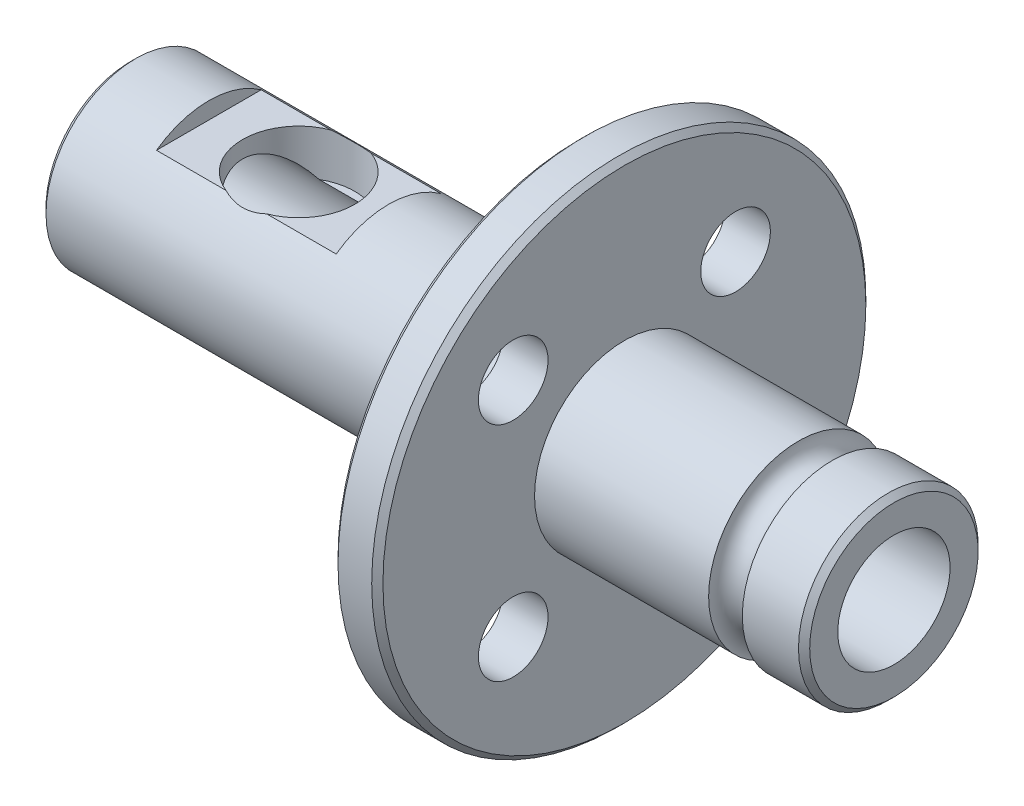
ISO-10303-21;
HEADER;
FILE_DESCRIPTION(('STEP AP214'),'2;1');
FILE_NAME('part.step','',(''),(''),'','','');
FILE_SCHEMA(('AUTOMOTIVE_DESIGN { 1 0 10303 214 1 1 1 1 }'));
ENDSEC;
DATA;
#1=APPLICATION_CONTEXT('core data for automotive mechanical design processes');
#2=APPLICATION_PROTOCOL_DEFINITION('international standard','automotive_design',2000,#1);
#3=PRODUCT_CONTEXT('',#1,'mechanical');
#4=PRODUCT('Part','Part','',(#3));
#5=PRODUCT_RELATED_PRODUCT_CATEGORY('part','',(#4));
#6=PRODUCT_DEFINITION_FORMATION('','',#4);
#7=PRODUCT_DEFINITION_CONTEXT('part definition',#1,'design');
#8=PRODUCT_DEFINITION('design','',#6,#7);
#9=PRODUCT_DEFINITION_SHAPE('','',#8);
#10=(LENGTH_UNIT() NAMED_UNIT(*) SI_UNIT(.MILLI.,.METRE.));
#11=(NAMED_UNIT(*) PLANE_ANGLE_UNIT() SI_UNIT($,.RADIAN.));
#12=(NAMED_UNIT(*) SI_UNIT($,.STERADIAN.) SOLID_ANGLE_UNIT());
#13=UNCERTAINTY_MEASURE_WITH_UNIT(LENGTH_MEASURE(1.E-05),#10,'distance_accuracy_value','');
#14=(GEOMETRIC_REPRESENTATION_CONTEXT(3) GLOBAL_UNCERTAINTY_ASSIGNED_CONTEXT((#13)) GLOBAL_UNIT_ASSIGNED_CONTEXT((#10,
#11,#12)) REPRESENTATION_CONTEXT('',''));
#15=CARTESIAN_POINT('',(0.,0.,0.));
#16=DIRECTION('',(0.,0.,1.));
#17=DIRECTION('',(1.,0.,0.));
#18=AXIS2_PLACEMENT_3D('',#15,#16,#17);
#19=CARTESIAN_POINT('',(0.,0.,0.));
#20=DIRECTION('',(1.,0.,0.));
#21=DIRECTION('',(0.,0.,-1.));
#22=AXIS2_PLACEMENT_3D('',#19,#20,#21);
#23=CYLINDRICAL_SURFACE('',#22,2.5);
#24=CARTESIAN_POINT('',(34.,0.,0.));
#25=DIRECTION('',(1.,0.,0.));
#26=DIRECTION('',(0.,0.,-1.));
#27=AXIS2_PLACEMENT_3D('',#24,#25,#26);
#28=CIRCLE('',#27,2.5);
#29=CARTESIAN_POINT('',(34.,0.,-2.5));
#30=VERTEX_POINT('',#29);
#31=EDGE_CURVE('E230',#30,#30,#28,.T.);
#32=ORIENTED_EDGE('',*,*,#31,.T.);
#33=EDGE_LOOP('',(#32));
#34=FACE_BOUND('',#33,.T.);
#35=CARTESIAN_POINT('',(0.,0.,0.));
#36=DIRECTION('',(1.,0.,0.));
#37=DIRECTION('',(0.,0.,-1.));
#38=AXIS2_PLACEMENT_3D('',#35,#36,#37);
#39=CIRCLE('',#38,2.5);
#40=CARTESIAN_POINT('',(0.,0.,-2.5));
#41=VERTEX_POINT('',#40);
#42=EDGE_CURVE('E231',#41,#41,#39,.T.);
#43=ORIENTED_EDGE('',*,*,#42,.F.);
#44=EDGE_LOOP('',(#43));
#45=FACE_BOUND('',#44,.T.);
#46=DIRECTION('',(1.,0.,0.));
#47=VECTOR('',#46,1.);
#48=CARTESIAN_POINT('',(0.,1.25,2.1650635094611));
#49=LINE('',#48,#47);
#50=CARTESIAN_POINT('',(8.75,1.25,2.1650635094611));
#51=VERTEX_POINT('',#50);
#52=CARTESIAN_POINT('',(6.25,1.25,2.1650635094611));
#53=VERTEX_POINT('',#52);
#54=EDGE_CURVE('E101',#51,#53,#49,.F.);
#55=ORIENTED_EDGE('',*,*,#54,.F.);
#56=CARTESIAN_POINT('',(7.5,0.,0.));
#57=DIRECTION('',(0.707106781186547,-0.707106781186547,0.));
#58=DIRECTION('',(0.707106781186547,0.707106781186547,0.));
#59=AXIS2_PLACEMENT_3D('',#56,#57,#58);
#60=ELLIPSE('',#59,3.53553390593274,2.5);
#61=CARTESIAN_POINT('',(8.75,1.25,-2.1650635094611));
#62=VERTEX_POINT('',#61);
#63=EDGE_CURVE('E89',#51,#62,#60,.F.);
#64=ORIENTED_EDGE('',*,*,#63,.T.);
#65=DIRECTION('',(1.,0.,0.));
#66=VECTOR('',#65,1.);
#67=CARTESIAN_POINT('',(0.,1.25,-2.1650635094611));
#68=LINE('',#67,#66);
#69=CARTESIAN_POINT('',(6.25,1.25,-2.1650635094611));
#70=VERTEX_POINT('',#69);
#71=EDGE_CURVE('E105',#70,#62,#68,.T.);
#72=ORIENTED_EDGE('',*,*,#71,.F.);
#73=CARTESIAN_POINT('',(7.5,0.,0.));
#74=DIRECTION('',(0.707106781186547,0.707106781186547,0.));
#75=DIRECTION('',(0.707106781186547,-0.707106781186547,0.));
#76=AXIS2_PLACEMENT_3D('',#73,#74,#75);
#77=ELLIPSE('',#76,3.53553390593274,2.5);
#78=EDGE_CURVE('E97',#70,#53,#77,.T.);
#79=ORIENTED_EDGE('',*,*,#78,.T.);
#80=EDGE_LOOP('',(#55,#64,#72,#79));
#81=FACE_BOUND('',#80,.T.);
#82=ADVANCED_FACE('F35',(#34,#45,#81),#23,.F.);
#83=CARTESIAN_POINT('',(0.,3.25,0.));
#84=DIRECTION('',(0.,1.,0.));
#85=DIRECTION('',(0.,0.,1.));
#86=AXIS2_PLACEMENT_3D('',#83,#84,#85);
#87=PLANE('',#86);
#88=CARTESIAN_POINT('',(7.5,3.25,0.));
#89=DIRECTION('',(0.,1.,0.));
#90=DIRECTION('',(0.,0.,1.));
#91=AXIS2_PLACEMENT_3D('',#88,#89,#90);
#92=CIRCLE('',#91,2.5);
#93=CARTESIAN_POINT('',(8.40138781886599,3.25,2.33184476327221));
#94=VERTEX_POINT('',#93);
#95=CARTESIAN_POINT('',(8.40138781886599,3.25,-2.33184476327221));
#96=VERTEX_POINT('',#95);
#97=EDGE_CURVE('E102',#94,#96,#92,.T.);
#98=ORIENTED_EDGE('',*,*,#97,.F.);
#99=DIRECTION('',(-1.,0.,0.));
#100=VECTOR('',#99,1.);
#101=CARTESIAN_POINT('',(0.,3.25,2.33184476327221));
#102=LINE('',#101,#100);
#103=CARTESIAN_POINT('',(11.5,3.25,2.33184476327221));
#104=VERTEX_POINT('',#103);
#105=EDGE_CURVE('E200',#94,#104,#102,.F.);
#106=ORIENTED_EDGE('',*,*,#105,.T.);
#107=DIRECTION('',(0.,0.,-1.));
#108=VECTOR('',#107,1.);
#109=CARTESIAN_POINT('',(11.5,3.25,-2.5));
#110=LINE('',#109,#108);
#111=CARTESIAN_POINT('',(11.5,3.25,-2.33184476327221));
#112=VERTEX_POINT('',#111);
#113=EDGE_CURVE('E220',#104,#112,#110,.T.);
#114=ORIENTED_EDGE('',*,*,#113,.T.);
#115=DIRECTION('',(-1.,0.,0.));
#116=VECTOR('',#115,1.);
#117=CARTESIAN_POINT('',(0.,3.25,-2.33184476327221));
#118=LINE('',#117,#116);
#119=EDGE_CURVE('E205',#112,#96,#118,.T.);
#120=ORIENTED_EDGE('',*,*,#119,.T.);
#121=EDGE_LOOP('',(#98,#106,#114,#120));
#122=FACE_BOUND('',#121,.T.);
#123=ADVANCED_FACE('F261',(#122),#87,.T.);
#124=CARTESIAN_POINT('',(0.,4.,0.));
#125=DIRECTION('',(1.,0.,0.));
#126=DIRECTION('',(0.,0.,-1.));
#127=AXIS2_PLACEMENT_3D('',#124,#125,#126);
#128=PLANE('',#127);
#129=CARTESIAN_POINT('',(0.,0.,0.));
#130=DIRECTION('',(1.,0.,0.));
#131=DIRECTION('',(0.,0.,-1.));
#132=AXIS2_PLACEMENT_3D('',#129,#130,#131);
#133=CIRCLE('',#132,3.75000000000001);
#134=CARTESIAN_POINT('',(0.,0.,-3.75000000000001));
#135=VERTEX_POINT('',#134);
#136=EDGE_CURVE('E116',#135,#135,#133,.F.);
#137=ORIENTED_EDGE('',*,*,#136,.T.);
#138=EDGE_LOOP('',(#137));
#139=FACE_BOUND('',#138,.T.);
#140=ORIENTED_EDGE('',*,*,#42,.T.);
#141=EDGE_LOOP('',(#140));
#142=FACE_BOUND('',#141,.T.);
#143=ADVANCED_FACE('F267',(#139,#142),#128,.F.);
#144=CARTESIAN_POINT('',(0.,0.,0.));
#145=DIRECTION('',(-1.,0.,0.));
#146=DIRECTION('',(0.,0.,1.));
#147=AXIS2_PLACEMENT_3D('',#144,#145,#146);
#148=CYLINDRICAL_SURFACE('',#147,4.);
#149=CARTESIAN_POINT('',(0.249999999999999,0.,0.));
#150=DIRECTION('',(1.,0.,0.));
#151=DIRECTION('',(0.,0.,-1.));
#152=AXIS2_PLACEMENT_3D('',#149,#150,#151);
#153=CIRCLE('',#152,4.);
#154=CARTESIAN_POINT('',(0.249999999999999,0.,-4.));
#155=VERTEX_POINT('',#154);
#156=EDGE_CURVE('E119',#155,#155,#153,.T.);
#157=ORIENTED_EDGE('',*,*,#156,.T.);
#158=EDGE_LOOP('',(#157));
#159=FACE_BOUND('',#158,.T.);
#160=CARTESIAN_POINT('',(6.59861218113401,3.25,-2.33184476327221));
#161=VERTEX_POINT('',#160);
#162=CARTESIAN_POINT('',(3.5,3.25,-2.33184476327221));
#163=VERTEX_POINT('',#162);
#164=EDGE_CURVE('E204',#161,#163,#118,.T.);
#165=ORIENTED_EDGE('',*,*,#164,.F.);
#166=CARTESIAN_POINT('',(6.59861218113401,3.25,-2.33184476327221));
#167=CARTESIAN_POINT('',(6.65107229883035,3.23545094828911,-2.35212058302273));
#168=CARTESIAN_POINT('',(6.70442824310383,3.22182658645101,-2.37071160075322));
#169=CARTESIAN_POINT('',(6.81279401949059,3.19678929465882,-2.40436642988356));
#170=CARTESIAN_POINT('',(6.86780517068709,3.18537818548835,-2.41942733926326));
#171=CARTESIAN_POINT('',(7.0346554506817,3.15510210712078,-2.45895458338862));
#172=CARTESIAN_POINT('',(7.14862216037379,3.14010445222921,-2.47788667647815));
#173=CARTESIAN_POINT('',(7.37964643909849,3.12268488518487,-2.49981057204269));
#174=CARTESIAN_POINT('',(7.49671724063432,3.12033039992166,-2.50271691027379));
#175=CARTESIAN_POINT('',(7.72960787339434,3.12876737924364,-2.4921581585379));
#176=CARTESIAN_POINT('',(7.84542819747563,3.13955345849472,-2.47869977525004));
#177=CARTESIAN_POINT('',(8.03523554008613,3.16713112663542,-2.44327392358348));
#178=CARTESIAN_POINT('',(8.11052898009851,3.18080999468615,-2.42552215130219));
#179=CARTESIAN_POINT('',(8.25823760046942,3.21243034120725,-2.38347754259047));
#180=CARTESIAN_POINT('',(8.33065660239288,3.23036592256853,-2.35919374925204));
#181=CARTESIAN_POINT('',(8.40138781886599,3.25,-2.33184476327221));
#182=B_SPLINE_CURVE_WITH_KNOTS('',3,(#166,#167,#168,#169,#170,#171,#172,#173,#174,#175,#176,
#177,#178,#179,#180,#181),.UNSPECIFIED.,.F.,.F.,(4,2,2,2,2,2,2,4),(0.,0.174209857347443,
0.348562430177185,0.696242801318246,1.04577554754894,1.39516509463678,1.63042268988579,
1.86535625021083),.UNSPECIFIED.);
#183=EDGE_CURVE('E58',#161,#96,#182,.T.);
#184=ORIENTED_EDGE('',*,*,#183,.T.);
#185=ORIENTED_EDGE('',*,*,#119,.F.);
#186=CARTESIAN_POINT('',(11.5,0.,0.));
#187=DIRECTION('',(1.,0.,0.));
#188=DIRECTION('',(0.,0.,-1.));
#189=AXIS2_PLACEMENT_3D('',#186,#187,#188);
#190=CIRCLE('',#189,4.);
#191=EDGE_CURVE('E178',#112,#104,#190,.T.);
#192=ORIENTED_EDGE('',*,*,#191,.T.);
#193=ORIENTED_EDGE('',*,*,#105,.F.);
#194=CARTESIAN_POINT('',(8.40138781886599,3.25,2.33184476327221));
#195=CARTESIAN_POINT('',(8.34892770116965,3.23545094828911,2.35212058302273));
#196=CARTESIAN_POINT('',(8.29557175689617,3.22182658645101,2.37071160075322));
#197=CARTESIAN_POINT('',(8.18720598050941,3.19678929465882,2.40436642988356));
#198=CARTESIAN_POINT('',(8.13219482931291,3.18537818548835,2.41942733926326));
#199=CARTESIAN_POINT('',(7.96534454931829,3.15510210712078,2.45895458338862));
#200=CARTESIAN_POINT('',(7.85137783962621,3.14010445222921,2.47788667647816));
#201=CARTESIAN_POINT('',(7.62035356090151,3.12268488518487,2.49981057204269));
#202=CARTESIAN_POINT('',(7.50328275936568,3.12033039992166,2.50271691027379));
#203=CARTESIAN_POINT('',(7.27039212660566,3.12876737924364,2.4921581585379));
#204=CARTESIAN_POINT('',(7.15457180252437,3.13955345849472,2.47869977525004));
#205=CARTESIAN_POINT('',(6.96476445991387,3.16713112663542,2.44327392358348));
#206=CARTESIAN_POINT('',(6.8894710199015,3.18080999468615,2.42552215130219));
#207=CARTESIAN_POINT('',(6.74176239953058,3.21243034120725,2.38347754259047));
#208=CARTESIAN_POINT('',(6.66934339760712,3.23036592256853,2.35919374925204));
#209=CARTESIAN_POINT('',(6.59861218113401,3.25,2.33184476327221));
#210=B_SPLINE_CURVE_WITH_KNOTS('',3,(#194,#195,#196,#197,#198,#199,#200,#201,#202,#203,#204,
#205,#206,#207,#208,#209),.UNSPECIFIED.,.F.,.F.,(4,2,2,2,2,2,2,4),(0.,0.174209857347443,
0.348562430177187,0.696242801318245,1.04577554754894,1.39516509463678,1.63042268988579,
1.86535625021084),.UNSPECIFIED.);
#211=CARTESIAN_POINT('',(6.59861218113401,3.25,2.33184476327221));
#212=VERTEX_POINT('',#211);
#213=EDGE_CURVE('E208',#94,#212,#210,.T.);
#214=ORIENTED_EDGE('',*,*,#213,.T.);
#215=CARTESIAN_POINT('',(3.5,3.25,2.33184476327221));
#216=VERTEX_POINT('',#215);
#217=EDGE_CURVE('E201',#216,#212,#102,.F.);
#218=ORIENTED_EDGE('',*,*,#217,.F.);
#219=CARTESIAN_POINT('',(3.5,0.,0.));
#220=DIRECTION('',(-1.,0.,0.));
#221=DIRECTION('',(0.,0.,1.));
#222=AXIS2_PLACEMENT_3D('',#219,#220,#221);
#223=CIRCLE('',#222,4.);
#224=EDGE_CURVE('E174',#216,#163,#223,.T.);
#225=ORIENTED_EDGE('',*,*,#224,.T.);
#226=EDGE_LOOP('',(#165,#184,#185,#192,#193,#214,#218,#225));
#227=FACE_BOUND('',#226,.T.);
#228=CARTESIAN_POINT('',(20.,0.,0.));
#229=DIRECTION('',(-1.,0.,0.));
#230=DIRECTION('',(0.,0.,1.));
#231=AXIS2_PLACEMENT_3D('',#228,#229,#230);
#232=CIRCLE('',#231,4.);
#233=CARTESIAN_POINT('',(20.,0.,4.));
#234=VERTEX_POINT('',#233);
#235=EDGE_CURVE('E172',#234,#234,#232,.T.);
#236=ORIENTED_EDGE('',*,*,#235,.T.);
#237=EDGE_LOOP('',(#236));
#238=FACE_BOUND('',#237,.T.);
#239=ADVANCED_FACE('F152',(#159,#227,#238),#148,.T.);
#240=CARTESIAN_POINT('',(20.,11.,0.));
#241=DIRECTION('',(1.,0.,0.));
#242=DIRECTION('',(0.,0.,-1.));
#243=AXIS2_PLACEMENT_3D('',#240,#241,#242);
#244=PLANE('',#243);
#245=CARTESIAN_POINT('',(20.,0.,0.));
#246=DIRECTION('',(1.,0.,0.));
#247=DIRECTION('',(0.,0.,-1.));
#248=AXIS2_PLACEMENT_3D('',#245,#246,#247);
#249=CIRCLE('',#248,10.75);
#250=CARTESIAN_POINT('',(20.,0.,-10.75));
#251=VERTEX_POINT('',#250);
#252=EDGE_CURVE('E11',#251,#251,#249,.F.);
#253=ORIENTED_EDGE('',*,*,#252,.T.);
#254=EDGE_LOOP('',(#253));
#255=FACE_BOUND('',#254,.T.);
#256=CARTESIAN_POINT('',(20.,4.94974746830553,4.94974746830586));
#257=DIRECTION('',(1.,0.,0.));
#258=DIRECTION('',(0.,0.,-1.));
#259=AXIS2_PLACEMENT_3D('',#256,#257,#258);
#260=CIRCLE('',#259,1.55000000000029);
#261=CARTESIAN_POINT('',(20.,4.94974746830553,3.39974746830557));
#262=VERTEX_POINT('',#261);
#263=EDGE_CURVE('E157',#262,#262,#260,.T.);
#264=ORIENTED_EDGE('',*,*,#263,.T.);
#265=EDGE_LOOP('',(#264));
#266=FACE_BOUND('',#265,.T.);
#267=CARTESIAN_POINT('',(20.,-4.94974746830613,4.94974746830554));
#268=DIRECTION('',(1.,0.,0.));
#269=DIRECTION('',(0.,0.,-1.));
#270=AXIS2_PLACEMENT_3D('',#267,#268,#269);
#271=CIRCLE('',#270,1.5500000000002);
#272=CARTESIAN_POINT('',(20.,-4.94974746830613,3.39974746830533));
#273=VERTEX_POINT('',#272);
#274=EDGE_CURVE('E161',#273,#273,#271,.T.);
#275=ORIENTED_EDGE('',*,*,#274,.T.);
#276=EDGE_LOOP('',(#275));
#277=FACE_BOUND('',#276,.T.);
#278=CARTESIAN_POINT('',(20.,-4.94974746830581,-4.94974746830613));
#279=DIRECTION('',(1.,0.,0.));
#280=DIRECTION('',(0.,0.,-1.));
#281=AXIS2_PLACEMENT_3D('',#278,#279,#280);
#282=CIRCLE('',#281,1.54999999999993);
#283=CARTESIAN_POINT('',(20.,-4.94974746830581,-6.49974746830606));
#284=VERTEX_POINT('',#283);
#285=EDGE_CURVE('E165',#284,#284,#282,.T.);
#286=ORIENTED_EDGE('',*,*,#285,.T.);
#287=EDGE_LOOP('',(#286));
#288=FACE_BOUND('',#287,.T.);
#289=CARTESIAN_POINT('',(20.,4.94974746830586,-4.94974746830581));
#290=DIRECTION('',(1.,0.,0.));
#291=DIRECTION('',(0.,0.,-1.));
#292=AXIS2_PLACEMENT_3D('',#289,#290,#291);
#293=CIRCLE('',#292,1.55);
#294=CARTESIAN_POINT('',(20.,4.94974746830586,-6.4997474683058));
#295=VERTEX_POINT('',#294);
#296=EDGE_CURVE('E169',#295,#295,#293,.T.);
#297=ORIENTED_EDGE('',*,*,#296,.T.);
#298=EDGE_LOOP('',(#297));
#299=FACE_BOUND('',#298,.T.);
#300=ORIENTED_EDGE('',*,*,#235,.F.);
#301=EDGE_LOOP('',(#300));
#302=FACE_BOUND('',#301,.T.);
#303=ADVANCED_FACE('F142',(#255,#266,#277,#288,#299,#302),#244,.F.);
#304=CARTESIAN_POINT('',(0.,0.,0.));
#305=DIRECTION('',(-1.,0.,0.));
#306=DIRECTION('',(0.,0.,1.));
#307=AXIS2_PLACEMENT_3D('',#304,#305,#306);
#308=CYLINDRICAL_SURFACE('',#307,11.);
#309=CARTESIAN_POINT('',(21.75,0.,0.));
#310=DIRECTION('',(-1.,0.,0.));
#311=DIRECTION('',(0.,0.,1.));
#312=AXIS2_PLACEMENT_3D('',#309,#310,#311);
#313=CIRCLE('',#312,11.);
#314=CARTESIAN_POINT('',(21.75,0.,11.));
#315=VERTEX_POINT('',#314);
#316=EDGE_CURVE('E125',#315,#315,#313,.T.);
#317=ORIENTED_EDGE('',*,*,#316,.T.);
#318=EDGE_LOOP('',(#317));
#319=FACE_BOUND('',#318,.T.);
#320=CARTESIAN_POINT('',(20.25,0.,0.));
#321=DIRECTION('',(1.,0.,0.));
#322=DIRECTION('',(0.,0.,-1.));
#323=AXIS2_PLACEMENT_3D('',#320,#321,#322);
#324=CIRCLE('',#323,11.);
#325=CARTESIAN_POINT('',(20.25,0.,-11.));
#326=VERTEX_POINT('',#325);
#327=EDGE_CURVE('E122',#326,#326,#324,.T.);
#328=ORIENTED_EDGE('',*,*,#327,.T.);
#329=EDGE_LOOP('',(#328));
#330=FACE_BOUND('',#329,.T.);
#331=ADVANCED_FACE('F139',(#319,#330),#308,.T.);
#332=CARTESIAN_POINT('',(22.,4.,0.));
#333=DIRECTION('',(-1.,0.,0.));
#334=DIRECTION('',(0.,0.,1.));
#335=AXIS2_PLACEMENT_3D('',#332,#333,#334);
#336=PLANE('',#335);
#337=CARTESIAN_POINT('',(22.,0.,0.));
#338=DIRECTION('',(-1.,0.,0.));
#339=DIRECTION('',(0.,0.,1.));
#340=AXIS2_PLACEMENT_3D('',#337,#338,#339);
#341=CIRCLE('',#340,10.75);
#342=CARTESIAN_POINT('',(22.,0.,10.75));
#343=VERTEX_POINT('',#342);
#344=EDGE_CURVE('E44',#343,#343,#341,.F.);
#345=ORIENTED_EDGE('',*,*,#344,.T.);
#346=EDGE_LOOP('',(#345));
#347=FACE_BOUND('',#346,.T.);
#348=CARTESIAN_POINT('',(22.,4.94974746830553,4.94974746830586));
#349=DIRECTION('',(-1.,0.,0.));
#350=DIRECTION('',(0.,0.,1.));
#351=AXIS2_PLACEMENT_3D('',#348,#349,#350);
#352=CIRCLE('',#351,1.55000000000029);
#353=CARTESIAN_POINT('',(22.,4.94974746830553,6.49974746830616));
#354=VERTEX_POINT('',#353);
#355=EDGE_CURVE('E195',#354,#354,#352,.T.);
#356=ORIENTED_EDGE('',*,*,#355,.T.);
#357=EDGE_LOOP('',(#356));
#358=FACE_BOUND('',#357,.T.);
#359=CARTESIAN_POINT('',(22.,-4.94974746830613,4.94974746830554));
#360=DIRECTION('',(-1.,0.,0.));
#361=DIRECTION('',(0.,0.,1.));
#362=AXIS2_PLACEMENT_3D('',#359,#360,#361);
#363=CIRCLE('',#362,1.5500000000002);
#364=CARTESIAN_POINT('',(22.,-4.94974746830613,6.49974746830574));
#365=VERTEX_POINT('',#364);
#366=EDGE_CURVE('E192',#365,#365,#363,.T.);
#367=ORIENTED_EDGE('',*,*,#366,.T.);
#368=EDGE_LOOP('',(#367));
#369=FACE_BOUND('',#368,.T.);
#370=CARTESIAN_POINT('',(22.,-4.94974746830581,-4.94974746830613));
#371=DIRECTION('',(-1.,0.,0.));
#372=DIRECTION('',(0.,0.,1.));
#373=AXIS2_PLACEMENT_3D('',#370,#371,#372);
#374=CIRCLE('',#373,1.54999999999993);
#375=CARTESIAN_POINT('',(22.,-4.94974746830581,-3.3997474683062));
#376=VERTEX_POINT('',#375);
#377=EDGE_CURVE('E189',#376,#376,#374,.T.);
#378=ORIENTED_EDGE('',*,*,#377,.T.);
#379=EDGE_LOOP('',(#378));
#380=FACE_BOUND('',#379,.T.);
#381=CARTESIAN_POINT('',(22.,4.94974746830586,-4.94974746830581));
#382=DIRECTION('',(-1.,0.,0.));
#383=DIRECTION('',(0.,0.,1.));
#384=AXIS2_PLACEMENT_3D('',#381,#382,#383);
#385=CIRCLE('',#384,1.55);
#386=CARTESIAN_POINT('',(22.,4.94974746830586,-3.3997474683058));
#387=VERTEX_POINT('',#386);
#388=EDGE_CURVE('E185',#387,#387,#385,.T.);
#389=ORIENTED_EDGE('',*,*,#388,.T.);
#390=EDGE_LOOP('',(#389));
#391=FACE_BOUND('',#390,.T.);
#392=CARTESIAN_POINT('',(22.,0.,0.));
#393=DIRECTION('',(-1.,0.,0.));
#394=DIRECTION('',(0.,0.,1.));
#395=AXIS2_PLACEMENT_3D('',#392,#393,#394);
#396=CIRCLE('',#395,4.);
#397=CARTESIAN_POINT('',(22.,0.,4.));
#398=VERTEX_POINT('',#397);
#399=EDGE_CURVE('E175',#398,#398,#396,.T.);
#400=ORIENTED_EDGE('',*,*,#399,.T.);
#401=EDGE_LOOP('',(#400));
#402=FACE_BOUND('',#401,.T.);
#403=ADVANCED_FACE('F130',(#347,#358,#369,#380,#391,#402),#336,.F.);
#404=CARTESIAN_POINT('',(0.,0.,0.));
#405=DIRECTION('',(-1.,0.,0.));
#406=DIRECTION('',(0.,0.,1.));
#407=AXIS2_PLACEMENT_3D('',#404,#405,#406);
#408=CYLINDRICAL_SURFACE('',#407,4.);
#409=ORIENTED_EDGE('',*,*,#399,.F.);
#410=EDGE_LOOP('',(#409));
#411=FACE_BOUND('',#410,.T.);
#412=CARTESIAN_POINT('',(29.75,0.,0.));
#413=DIRECTION('',(-1.,0.,0.));
#414=DIRECTION('',(0.,0.,1.));
#415=AXIS2_PLACEMENT_3D('',#412,#413,#414);
#416=CIRCLE('',#415,4.);
#417=CARTESIAN_POINT('',(29.75,0.,4.));
#418=VERTEX_POINT('',#417);
#419=EDGE_CURVE('E181',#418,#418,#416,.T.);
#420=ORIENTED_EDGE('',*,*,#419,.T.);
#421=EDGE_LOOP('',(#420));
#422=FACE_BOUND('',#421,.T.);
#423=ADVANCED_FACE('F241',(#411,#422),#408,.T.);
#424=CARTESIAN_POINT('',(30.5,0.,0.));
#425=DIRECTION('',(-1.,0.,0.));
#426=DIRECTION('',(0.,0.,1.));
#427=AXIS2_PLACEMENT_3D('',#424,#425,#426);
#428=TOROIDAL_SURFACE('',#427,4.,0.750000000000001);
#429=ORIENTED_EDGE('',*,*,#419,.F.);
#430=EDGE_LOOP('',(#429));
#431=FACE_BOUND('',#430,.T.);
#432=CARTESIAN_POINT('',(31.25,0.,0.));
#433=DIRECTION('',(-1.,0.,0.));
#434=DIRECTION('',(0.,0.,1.));
#435=AXIS2_PLACEMENT_3D('',#432,#433,#434);
#436=CIRCLE('',#435,4.);
#437=CARTESIAN_POINT('',(31.25,0.,4.));
#438=VERTEX_POINT('',#437);
#439=EDGE_CURVE('E234',#438,#438,#436,.T.);
#440=ORIENTED_EDGE('',*,*,#439,.T.);
#441=EDGE_LOOP('',(#440));
#442=FACE_BOUND('',#441,.T.);
#443=ADVANCED_FACE('F243',(#431,#442),#428,.F.);
#444=CARTESIAN_POINT('',(0.,0.,0.));
#445=DIRECTION('',(-1.,0.,0.));
#446=DIRECTION('',(0.,0.,1.));
#447=AXIS2_PLACEMENT_3D('',#444,#445,#446);
#448=CYLINDRICAL_SURFACE('',#447,4.);
#449=CARTESIAN_POINT('',(33.75,0.,0.));
#450=DIRECTION('',(-1.,0.,0.));
#451=DIRECTION('',(0.,0.,1.));
#452=AXIS2_PLACEMENT_3D('',#449,#450,#451);
#453=CIRCLE('',#452,4.);
#454=CARTESIAN_POINT('',(33.75,0.,4.));
#455=VERTEX_POINT('',#454);
#456=EDGE_CURVE('E104',#455,#455,#453,.T.);
#457=ORIENTED_EDGE('',*,*,#456,.T.);
#458=EDGE_LOOP('',(#457));
#459=FACE_BOUND('',#458,.T.);
#460=ORIENTED_EDGE('',*,*,#439,.F.);
#461=EDGE_LOOP('',(#460));
#462=FACE_BOUND('',#461,.T.);
#463=ADVANCED_FACE('F246',(#459,#462),#448,.T.);
#464=CARTESIAN_POINT('',(34.,0.,0.));
#465=DIRECTION('',(-1.,0.,0.));
#466=DIRECTION('',(0.,0.,1.));
#467=AXIS2_PLACEMENT_3D('',#464,#465,#466);
#468=PLANE('',#467);
#469=CARTESIAN_POINT('',(34.,0.,0.));
#470=DIRECTION('',(-1.,0.,0.));
#471=DIRECTION('',(0.,0.,1.));
#472=AXIS2_PLACEMENT_3D('',#469,#470,#471);
#473=CIRCLE('',#472,3.75000000000001);
#474=CARTESIAN_POINT('',(34.,0.,3.75000000000001));
#475=VERTEX_POINT('',#474);
#476=EDGE_CURVE('E108',#475,#475,#473,.F.);
#477=ORIENTED_EDGE('',*,*,#476,.T.);
#478=EDGE_LOOP('',(#477));
#479=FACE_BOUND('',#478,.T.);
#480=ORIENTED_EDGE('',*,*,#31,.F.);
#481=EDGE_LOOP('',(#480));
#482=FACE_BOUND('',#481,.T.);
#483=ADVANCED_FACE('F251',(#479,#482),#468,.F.);
#484=CARTESIAN_POINT('',(0.,4.94974746830586,-4.94974746830581));
#485=DIRECTION('',(1.,0.,0.));
#486=DIRECTION('',(0.,0.,-1.));
#487=AXIS2_PLACEMENT_3D('',#484,#485,#486);
#488=CYLINDRICAL_SURFACE('',#487,1.55);
#489=ORIENTED_EDGE('',*,*,#388,.F.);
#490=EDGE_LOOP('',(#489));
#491=FACE_BOUND('',#490,.T.);
#492=ORIENTED_EDGE('',*,*,#296,.F.);
#493=EDGE_LOOP('',(#492));
#494=FACE_BOUND('',#493,.T.);
#495=ADVANCED_FACE('F257',(#491,#494),#488,.F.);
#496=CARTESIAN_POINT('',(0.,-4.94974746830581,-4.94974746830613));
#497=DIRECTION('',(1.,0.,0.));
#498=DIRECTION('',(0.,0.,-1.));
#499=AXIS2_PLACEMENT_3D('',#496,#497,#498);
#500=CYLINDRICAL_SURFACE('',#499,1.54999999999993);
#501=ORIENTED_EDGE('',*,*,#377,.F.);
#502=EDGE_LOOP('',(#501));
#503=FACE_BOUND('',#502,.T.);
#504=ORIENTED_EDGE('',*,*,#285,.F.);
#505=EDGE_LOOP('',(#504));
#506=FACE_BOUND('',#505,.T.);
#507=ADVANCED_FACE('F274',(#503,#506),#500,.F.);
#508=CARTESIAN_POINT('',(0.,-4.94974746830613,4.94974746830554));
#509=DIRECTION('',(1.,0.,0.));
#510=DIRECTION('',(0.,0.,-1.));
#511=AXIS2_PLACEMENT_3D('',#508,#509,#510);
#512=CYLINDRICAL_SURFACE('',#511,1.5500000000002);
#513=ORIENTED_EDGE('',*,*,#366,.F.);
#514=EDGE_LOOP('',(#513));
#515=FACE_BOUND('',#514,.T.);
#516=ORIENTED_EDGE('',*,*,#274,.F.);
#517=EDGE_LOOP('',(#516));
#518=FACE_BOUND('',#517,.T.);
#519=ADVANCED_FACE('F280',(#515,#518),#512,.F.);
#520=CARTESIAN_POINT('',(0.,4.94974746830553,4.94974746830586));
#521=DIRECTION('',(1.,0.,0.));
#522=DIRECTION('',(0.,0.,-1.));
#523=AXIS2_PLACEMENT_3D('',#520,#521,#522);
#524=CYLINDRICAL_SURFACE('',#523,1.55000000000029);
#525=ORIENTED_EDGE('',*,*,#355,.F.);
#526=EDGE_LOOP('',(#525));
#527=FACE_BOUND('',#526,.T.);
#528=ORIENTED_EDGE('',*,*,#263,.F.);
#529=EDGE_LOOP('',(#528));
#530=FACE_BOUND('',#529,.T.);
#531=ADVANCED_FACE('F276',(#527,#530),#524,.F.);
#532=CARTESIAN_POINT('',(11.5,3.25,-2.5));
#533=DIRECTION('',(1.,0.,0.));
#534=DIRECTION('',(0.,0.,-1.));
#535=AXIS2_PLACEMENT_3D('',#532,#533,#534);
#536=PLANE('',#535);
#537=ORIENTED_EDGE('',*,*,#113,.F.);
#538=ORIENTED_EDGE('',*,*,#191,.F.);
#539=EDGE_LOOP('',(#537,#538));
#540=FACE_BOUND('',#539,.T.);
#541=ADVANCED_FACE('F279',(#540),#536,.F.);
#542=CARTESIAN_POINT('',(3.5,3.25,-2.5));
#543=DIRECTION('',(-1.,0.,0.));
#544=DIRECTION('',(0.,0.,1.));
#545=AXIS2_PLACEMENT_3D('',#542,#543,#544);
#546=PLANE('',#545);
#547=DIRECTION('',(0.,0.,1.));
#548=VECTOR('',#547,1.);
#549=CARTESIAN_POINT('',(3.5,3.25,-2.5));
#550=LINE('',#549,#548);
#551=EDGE_CURVE('E188',#163,#216,#550,.T.);
#552=ORIENTED_EDGE('',*,*,#551,.F.);
#553=ORIENTED_EDGE('',*,*,#224,.F.);
#554=EDGE_LOOP('',(#552,#553));
#555=FACE_BOUND('',#554,.T.);
#556=ADVANCED_FACE('F290',(#555),#546,.F.);
#557=CARTESIAN_POINT('',(7.5,3.25,0.));
#558=DIRECTION('',(0.,1.,0.));
#559=DIRECTION('',(0.,0.,1.));
#560=AXIS2_PLACEMENT_3D('',#557,#558,#559);
#561=CIRCLE('',#560,2.5);
#562=EDGE_CURVE('E110',#161,#212,#561,.T.);
#563=ORIENTED_EDGE('',*,*,#562,.F.);
#564=ORIENTED_EDGE('',*,*,#164,.T.);
#565=ORIENTED_EDGE('',*,*,#551,.T.);
#566=ORIENTED_EDGE('',*,*,#217,.T.);
#567=EDGE_LOOP('',(#563,#564,#565,#566));
#568=FACE_BOUND('',#567,.T.);
#569=ADVANCED_FACE('F217',(#568),#87,.T.);
#570=CARTESIAN_POINT('',(7.5,1.25,0.));
#571=DIRECTION('',(0.,1.,0.));
#572=DIRECTION('',(0.,0.,1.));
#573=AXIS2_PLACEMENT_3D('',#570,#571,#572);
#574=PLANE('',#573);
#575=ORIENTED_EDGE('',*,*,#54,.T.);
#576=CARTESIAN_POINT('',(7.5,1.25,0.));
#577=DIRECTION('',(0.,1.,0.));
#578=DIRECTION('',(0.,0.,1.));
#579=AXIS2_PLACEMENT_3D('',#576,#577,#578);
#580=CIRCLE('',#579,2.5);
#581=EDGE_CURVE('E92',#53,#51,#580,.T.);
#582=ORIENTED_EDGE('',*,*,#581,.T.);
#583=EDGE_LOOP('',(#575,#582));
#584=FACE_BOUND('',#583,.T.);
#585=ADVANCED_FACE('F100',(#584),#574,.T.);
#586=ORIENTED_EDGE('',*,*,#71,.T.);
#587=EDGE_CURVE('E50',#62,#70,#580,.T.);
#588=ORIENTED_EDGE('',*,*,#587,.T.);
#589=EDGE_LOOP('',(#586,#588));
#590=FACE_BOUND('',#589,.T.);
#591=ADVANCED_FACE('F299',(#590),#574,.T.);
#592=CARTESIAN_POINT('',(7.5,1.25,0.));
#593=DIRECTION('',(0.,1.,0.));
#594=DIRECTION('',(0.,0.,1.));
#595=AXIS2_PLACEMENT_3D('',#592,#593,#594);
#596=CYLINDRICAL_SURFACE('',#595,2.5);
#597=ORIENTED_EDGE('',*,*,#587,.F.);
#598=ORIENTED_EDGE('',*,*,#63,.F.);
#599=ORIENTED_EDGE('',*,*,#581,.F.);
#600=ORIENTED_EDGE('',*,*,#78,.F.);
#601=EDGE_LOOP('',(#597,#598,#599,#600));
#602=FACE_BOUND('',#601,.T.);
#603=ORIENTED_EDGE('',*,*,#562,.T.);
#604=ORIENTED_EDGE('',*,*,#213,.F.);
#605=ORIENTED_EDGE('',*,*,#97,.T.);
#606=ORIENTED_EDGE('',*,*,#183,.F.);
#607=EDGE_LOOP('',(#603,#604,#605,#606));
#608=FACE_BOUND('',#607,.T.);
#609=ADVANCED_FACE('F91',(#602,#608),#596,.F.);
#610=CARTESIAN_POINT('',(33.75,0.,0.));
#611=DIRECTION('',(-1.,0.,0.));
#612=DIRECTION('',(0.,0.,1.));
#613=AXIS2_PLACEMENT_3D('',#610,#611,#612);
#614=CONICAL_SURFACE('',#613,4.,0.785398163397435);
#615=ORIENTED_EDGE('',*,*,#476,.F.);
#616=EDGE_LOOP('',(#615));
#617=FACE_BOUND('',#616,.T.);
#618=ORIENTED_EDGE('',*,*,#456,.F.);
#619=EDGE_LOOP('',(#618));
#620=FACE_BOUND('',#619,.T.);
#621=ADVANCED_FACE('F298',(#617,#620),#614,.T.);
#622=CARTESIAN_POINT('',(0.,0.,0.));
#623=DIRECTION('',(1.,0.,0.));
#624=DIRECTION('',(0.,0.,-1.));
#625=AXIS2_PLACEMENT_3D('',#622,#623,#624);
#626=CONICAL_SURFACE('',#625,3.75000000000001,0.785398163397434);
#627=ORIENTED_EDGE('',*,*,#156,.F.);
#628=EDGE_LOOP('',(#627));
#629=FACE_BOUND('',#628,.T.);
#630=ORIENTED_EDGE('',*,*,#136,.F.);
#631=EDGE_LOOP('',(#630));
#632=FACE_BOUND('',#631,.T.);
#633=ADVANCED_FACE('F136',(#629,#632),#626,.T.);
#634=CARTESIAN_POINT('',(21.75,0.,0.));
#635=DIRECTION('',(-1.,0.,0.));
#636=DIRECTION('',(0.,0.,1.));
#637=AXIS2_PLACEMENT_3D('',#634,#635,#636);
#638=CONICAL_SURFACE('',#637,11.,0.785398163397441);
#639=ORIENTED_EDGE('',*,*,#344,.F.);
#640=EDGE_LOOP('',(#639));
#641=FACE_BOUND('',#640,.T.);
#642=ORIENTED_EDGE('',*,*,#316,.F.);
#643=EDGE_LOOP('',(#642));
#644=FACE_BOUND('',#643,.T.);
#645=ADVANCED_FACE('F133',(#641,#644),#638,.T.);
#646=CARTESIAN_POINT('',(20.,0.,0.));
#647=DIRECTION('',(1.,0.,0.));
#648=DIRECTION('',(0.,0.,-1.));
#649=AXIS2_PLACEMENT_3D('',#646,#647,#648);
#650=CONICAL_SURFACE('',#649,10.75,0.785398163397441);
#651=ORIENTED_EDGE('',*,*,#327,.F.);
#652=EDGE_LOOP('',(#651));
#653=FACE_BOUND('',#652,.T.);
#654=ORIENTED_EDGE('',*,*,#252,.F.);
#655=EDGE_LOOP('',(#654));
#656=FACE_BOUND('',#655,.T.);
#657=ADVANCED_FACE('F38',(#653,#656),#650,.T.);
#658=CLOSED_SHELL('',(#82,#123,#143,#239,#303,#331,#403,#423,#443,#463,#483,#495,#507,#519,#531,
#541,#556,#569,#585,#591,#609,#621,#633,#645,#657));
#659=MANIFOLD_SOLID_BREP('B2',#658);
#660=ADVANCED_BREP_SHAPE_REPRESENTATION('',(#18,#659),#14);
#661=SHAPE_DEFINITION_REPRESENTATION(#9,#660);
ENDSEC;
END-ISO-10303-21;
